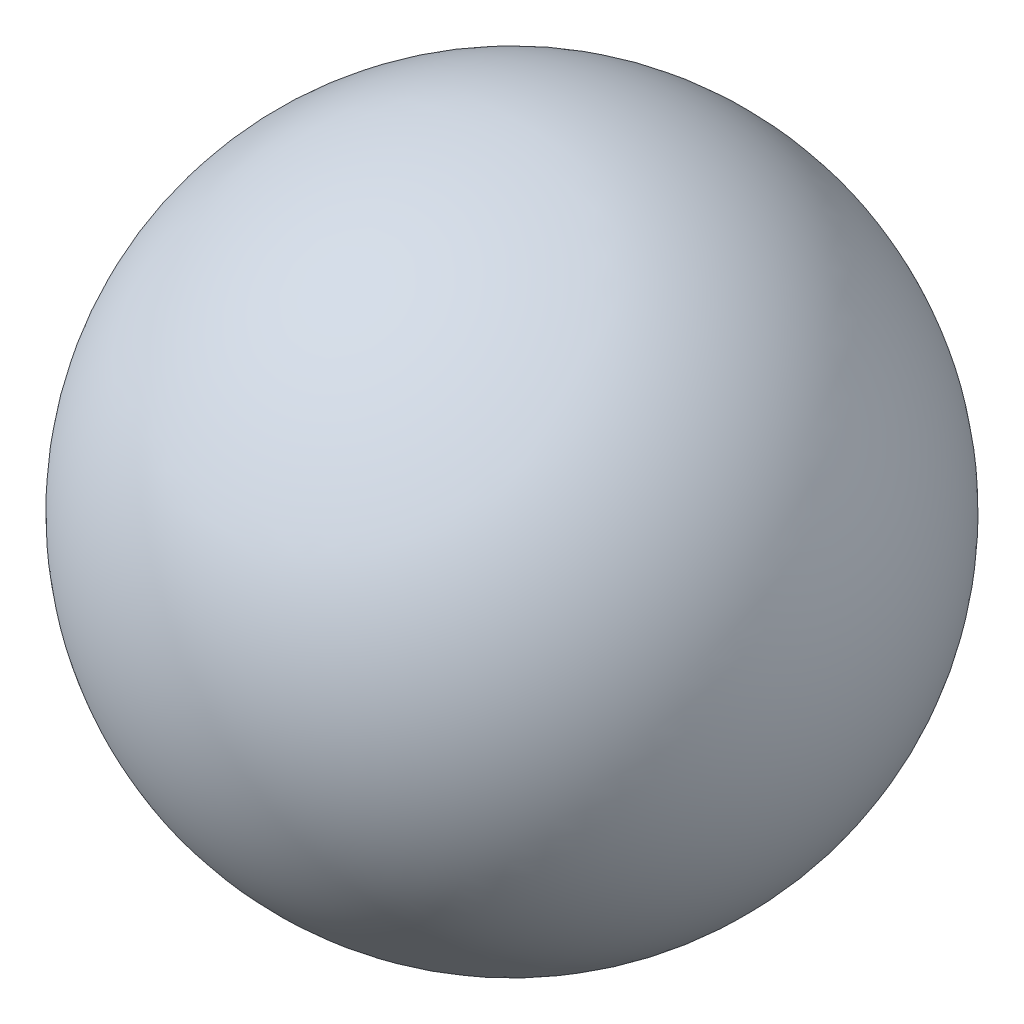
ISO-10303-21;
HEADER;
FILE_DESCRIPTION(('STEP AP214'),'2;1');
FILE_NAME('part.step','',(''),(''),'','','');
FILE_SCHEMA(('AUTOMOTIVE_DESIGN { 1 0 10303 214 1 1 1 1 }'));
ENDSEC;
DATA;
#1=APPLICATION_CONTEXT('core data for automotive mechanical design processes');
#2=APPLICATION_PROTOCOL_DEFINITION('international standard','automotive_design',2000,#1);
#3=PRODUCT_CONTEXT('',#1,'mechanical');
#4=PRODUCT('Part','Part','',(#3));
#5=PRODUCT_RELATED_PRODUCT_CATEGORY('part','',(#4));
#6=PRODUCT_DEFINITION_FORMATION('','',#4);
#7=PRODUCT_DEFINITION_CONTEXT('part definition',#1,'design');
#8=PRODUCT_DEFINITION('design','',#6,#7);
#9=PRODUCT_DEFINITION_SHAPE('','',#8);
#10=(LENGTH_UNIT() NAMED_UNIT(*) SI_UNIT(.MILLI.,.METRE.));
#11=(NAMED_UNIT(*) PLANE_ANGLE_UNIT() SI_UNIT($,.RADIAN.));
#12=(NAMED_UNIT(*) SI_UNIT($,.STERADIAN.) SOLID_ANGLE_UNIT());
#13=UNCERTAINTY_MEASURE_WITH_UNIT(LENGTH_MEASURE(1.E-05),#10,'distance_accuracy_value','');
#14=(GEOMETRIC_REPRESENTATION_CONTEXT(3) GLOBAL_UNCERTAINTY_ASSIGNED_CONTEXT((#13)) GLOBAL_UNIT_ASSIGNED_CONTEXT((#10,
#11,#12)) REPRESENTATION_CONTEXT('',''));
#15=CARTESIAN_POINT('',(0.,0.,0.));
#16=DIRECTION('',(0.,0.,1.));
#17=DIRECTION('',(1.,0.,0.));
#18=AXIS2_PLACEMENT_3D('',#15,#16,#17);
#19=CARTESIAN_POINT('',(0.,0.,0.));
#20=DIRECTION('',(0.,0.,-1.));
#21=DIRECTION('',(1.,0.,0.));
#22=AXIS2_PLACEMENT_3D('',#19,#20,#21);
#23=SPHERICAL_SURFACE('',#22,350.);
#24=CARTESIAN_POINT('',(0.,0.,-350.));
#25=VERTEX_POINT('',#24);
#26=VERTEX_LOOP('',#25);
#27=FACE_BOUND('',#26,.T.);
#28=ADVANCED_FACE('F43',(#27),#23,.T.);
#29=CLOSED_SHELL('',(#28));
#30=MANIFOLD_SOLID_BREP('B2',#29);
#31=ADVANCED_BREP_SHAPE_REPRESENTATION('',(#18,#30),#14);
#32=SHAPE_DEFINITION_REPRESENTATION(#9,#31);
ENDSEC;
END-ISO-10303-21;
